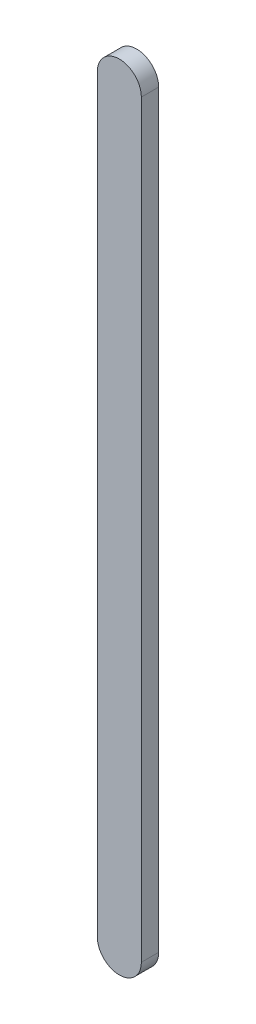
ISO-10303-21;
HEADER;
FILE_DESCRIPTION(('STEP AP214'),'2;1');
FILE_NAME('part.step','',(''),(''),'','','');
FILE_SCHEMA(('AUTOMOTIVE_DESIGN { 1 0 10303 214 1 1 1 1 }'));
ENDSEC;
DATA;
#1=APPLICATION_CONTEXT('core data for automotive mechanical design processes');
#2=APPLICATION_PROTOCOL_DEFINITION('international standard','automotive_design',2000,#1);
#3=PRODUCT_CONTEXT('',#1,'mechanical');
#4=PRODUCT('Part','Part','',(#3));
#5=PRODUCT_RELATED_PRODUCT_CATEGORY('part','',(#4));
#6=PRODUCT_DEFINITION_FORMATION('','',#4);
#7=PRODUCT_DEFINITION_CONTEXT('part definition',#1,'design');
#8=PRODUCT_DEFINITION('design','',#6,#7);
#9=PRODUCT_DEFINITION_SHAPE('','',#8);
#10=(LENGTH_UNIT() NAMED_UNIT(*) SI_UNIT(.MILLI.,.METRE.));
#11=(NAMED_UNIT(*) PLANE_ANGLE_UNIT() SI_UNIT($,.RADIAN.));
#12=(NAMED_UNIT(*) SI_UNIT($,.STERADIAN.) SOLID_ANGLE_UNIT());
#13=UNCERTAINTY_MEASURE_WITH_UNIT(LENGTH_MEASURE(1.E-05),#10,'distance_accuracy_value','');
#14=(GEOMETRIC_REPRESENTATION_CONTEXT(3) GLOBAL_UNCERTAINTY_ASSIGNED_CONTEXT((#13)) GLOBAL_UNIT_ASSIGNED_CONTEXT((#10,
#11,#12)) REPRESENTATION_CONTEXT('',''));
#15=CARTESIAN_POINT('',(0.,0.,0.));
#16=DIRECTION('',(0.,0.,1.));
#17=DIRECTION('',(1.,0.,0.));
#18=AXIS2_PLACEMENT_3D('',#15,#16,#17);
#19=CARTESIAN_POINT('',(130.937,78.212696,0.));
#20=DIRECTION('',(-1.,0.,0.));
#21=DIRECTION('',(0.,1.,0.));
#22=AXIS2_PLACEMENT_3D('',#19,#20,#21);
#23=PLANE('',#22);
#24=DIRECTION('',(0.,1.,0.));
#25=VECTOR('',#24,1.);
#26=CARTESIAN_POINT('',(130.937,78.212696,0.1999996));
#27=LINE('',#26,#25);
#28=CARTESIAN_POINT('',(130.937,78.212696,0.1999996));
#29=VERTEX_POINT('',#28);
#30=CARTESIAN_POINT('',(130.937,86.8607356,0.1999996));
#31=VERTEX_POINT('',#30);
#32=EDGE_CURVE('E11',#29,#31,#27,.T.);
#33=ORIENTED_EDGE('',*,*,#32,.F.);
#34=DIRECTION('',(0.,0.,1.));
#35=VECTOR('',#34,1.);
#36=CARTESIAN_POINT('',(130.937,78.212696,0.));
#37=LINE('',#36,#35);
#38=CARTESIAN_POINT('',(130.937,78.212696,0.));
#39=VERTEX_POINT('',#38);
#40=EDGE_CURVE('E24',#39,#29,#37,.T.);
#41=ORIENTED_EDGE('',*,*,#40,.F.);
#42=DIRECTION('',(0.,1.,0.));
#43=VECTOR('',#42,1.);
#44=CARTESIAN_POINT('',(130.937,78.212696,0.));
#45=LINE('',#44,#43);
#46=CARTESIAN_POINT('',(130.937,86.8607356,0.));
#47=VERTEX_POINT('',#46);
#48=EDGE_CURVE('E75',#39,#47,#45,.T.);
#49=ORIENTED_EDGE('',*,*,#48,.T.);
#50=DIRECTION('',(0.,0.,1.));
#51=VECTOR('',#50,1.);
#52=CARTESIAN_POINT('',(130.937,86.8607356,0.));
#53=LINE('',#52,#51);
#54=EDGE_CURVE('E37',#47,#31,#53,.T.);
#55=ORIENTED_EDGE('',*,*,#54,.T.);
#56=EDGE_LOOP('',(#33,#41,#49,#55));
#57=FACE_BOUND('',#56,.T.);
#58=ADVANCED_FACE('F17',(#57),#23,.F.);
#59=CARTESIAN_POINT('',(130.683,86.8607356,0.));
#60=DIRECTION('',(0.,0.,-1.));
#61=DIRECTION('',(1.,1.1189649382048E-13,0.));
#62=AXIS2_PLACEMENT_3D('',#59,#60,#61);
#63=CYLINDRICAL_SURFACE('',#62,0.25400000000001);
#64=CARTESIAN_POINT('',(130.683,86.8607356,0.1999996));
#65=DIRECTION('',(0.,0.,1.));
#66=DIRECTION('',(1.,1.1189649382048E-13,0.));
#67=AXIS2_PLACEMENT_3D('',#64,#65,#66);
#68=CIRCLE('',#67,0.25400000000001);
#69=CARTESIAN_POINT('',(130.429,86.8607356,0.1999996));
#70=VERTEX_POINT('',#69);
#71=EDGE_CURVE('E83',#31,#70,#68,.T.);
#72=ORIENTED_EDGE('',*,*,#71,.F.);
#73=ORIENTED_EDGE('',*,*,#54,.F.);
#74=CARTESIAN_POINT('',(130.683,86.8607356,0.));
#75=DIRECTION('',(0.,0.,1.));
#76=DIRECTION('',(1.,1.1189649382048E-13,0.));
#77=AXIS2_PLACEMENT_3D('',#74,#75,#76);
#78=CIRCLE('',#77,0.25400000000001);
#79=CARTESIAN_POINT('',(130.429,86.8607356,0.));
#80=VERTEX_POINT('',#79);
#81=EDGE_CURVE('E81',#47,#80,#78,.T.);
#82=ORIENTED_EDGE('',*,*,#81,.T.);
#83=DIRECTION('',(0.,0.,1.));
#84=VECTOR('',#83,1.);
#85=CARTESIAN_POINT('',(130.429,86.8607356,0.));
#86=LINE('',#85,#84);
#87=EDGE_CURVE('E67',#80,#70,#86,.T.);
#88=ORIENTED_EDGE('',*,*,#87,.T.);
#89=EDGE_LOOP('',(#72,#73,#82,#88));
#90=FACE_BOUND('',#89,.T.);
#91=ADVANCED_FACE('F89',(#90),#63,.T.);
#92=CARTESIAN_POINT('',(130.429,86.8607356,0.));
#93=DIRECTION('',(1.,0.,0.));
#94=DIRECTION('',(0.,-1.,0.));
#95=AXIS2_PLACEMENT_3D('',#92,#93,#94);
#96=PLANE('',#95);
#97=DIRECTION('',(0.,-1.,0.));
#98=VECTOR('',#97,1.);
#99=CARTESIAN_POINT('',(130.429,86.8607356,0.1999996));
#100=LINE('',#99,#98);
#101=CARTESIAN_POINT('',(130.429,78.212696,0.1999996));
#102=VERTEX_POINT('',#101);
#103=EDGE_CURVE('E71',#70,#102,#100,.T.);
#104=ORIENTED_EDGE('',*,*,#103,.F.);
#105=ORIENTED_EDGE('',*,*,#87,.F.);
#106=DIRECTION('',(0.,-1.,0.));
#107=VECTOR('',#106,1.);
#108=CARTESIAN_POINT('',(130.429,86.8607356,0.));
#109=LINE('',#108,#107);
#110=CARTESIAN_POINT('',(130.429,78.212696,0.));
#111=VERTEX_POINT('',#110);
#112=EDGE_CURVE('E63',#80,#111,#109,.T.);
#113=ORIENTED_EDGE('',*,*,#112,.T.);
#114=DIRECTION('',(0.,0.,1.));
#115=VECTOR('',#114,1.);
#116=CARTESIAN_POINT('',(130.429,78.212696,0.));
#117=LINE('',#116,#115);
#118=EDGE_CURVE('E53',#111,#102,#117,.T.);
#119=ORIENTED_EDGE('',*,*,#118,.T.);
#120=EDGE_LOOP('',(#104,#105,#113,#119));
#121=FACE_BOUND('',#120,.T.);
#122=ADVANCED_FACE('F66',(#121),#96,.F.);
#123=CARTESIAN_POINT('',(130.683,78.212696,0.));
#124=DIRECTION('',(0.,0.,-1.));
#125=DIRECTION('',(-1.,-1.11896493820492E-13,0.));
#126=AXIS2_PLACEMENT_3D('',#123,#124,#125);
#127=CYLINDRICAL_SURFACE('',#126,0.25400000000001);
#128=CARTESIAN_POINT('',(130.683,78.212696,0.1999996));
#129=DIRECTION('',(0.,0.,1.));
#130=DIRECTION('',(-1.,-1.11896493820492E-13,0.));
#131=AXIS2_PLACEMENT_3D('',#128,#129,#130);
#132=CIRCLE('',#131,0.25400000000001);
#133=EDGE_CURVE('E59',#102,#29,#132,.T.);
#134=ORIENTED_EDGE('',*,*,#133,.F.);
#135=ORIENTED_EDGE('',*,*,#118,.F.);
#136=CARTESIAN_POINT('',(130.683,78.212696,0.));
#137=DIRECTION('',(0.,0.,1.));
#138=DIRECTION('',(-1.,-1.11896493820492E-13,0.));
#139=AXIS2_PLACEMENT_3D('',#136,#137,#138);
#140=CIRCLE('',#139,0.25400000000001);
#141=EDGE_CURVE('E57',#111,#39,#140,.T.);
#142=ORIENTED_EDGE('',*,*,#141,.T.);
#143=ORIENTED_EDGE('',*,*,#40,.T.);
#144=EDGE_LOOP('',(#134,#135,#142,#143));
#145=FACE_BOUND('',#144,.T.);
#146=ADVANCED_FACE('F55',(#145),#127,.T.);
#147=CARTESIAN_POINT('',(130.937,78.212696,0.));
#148=DIRECTION('',(0.,0.,-1.));
#149=DIRECTION('',(-1.,0.,0.));
#150=AXIS2_PLACEMENT_3D('',#147,#148,#149);
#151=PLANE('',#150);
#152=ORIENTED_EDGE('',*,*,#141,.F.);
#153=ORIENTED_EDGE('',*,*,#112,.F.);
#154=ORIENTED_EDGE('',*,*,#81,.F.);
#155=ORIENTED_EDGE('',*,*,#48,.F.);
#156=EDGE_LOOP('',(#152,#153,#154,#155));
#157=FACE_BOUND('',#156,.T.);
#158=ADVANCED_FACE('F74',(#157),#151,.T.);
#159=CARTESIAN_POINT('',(130.937,78.212696,0.1999996));
#160=DIRECTION('',(0.,0.,-1.));
#161=DIRECTION('',(-1.,0.,0.));
#162=AXIS2_PLACEMENT_3D('',#159,#160,#161);
#163=PLANE('',#162);
#164=ORIENTED_EDGE('',*,*,#32,.T.);
#165=ORIENTED_EDGE('',*,*,#71,.T.);
#166=ORIENTED_EDGE('',*,*,#103,.T.);
#167=ORIENTED_EDGE('',*,*,#133,.T.);
#168=EDGE_LOOP('',(#164,#165,#166,#167));
#169=FACE_BOUND('',#168,.T.);
#170=ADVANCED_FACE('F91',(#169),#163,.F.);
#171=CLOSED_SHELL('',(#58,#91,#122,#146,#158,#170));
#172=MANIFOLD_SOLID_BREP('B1',#171);
#173=ADVANCED_BREP_SHAPE_REPRESENTATION('',(#18,#172),#14);
#174=SHAPE_DEFINITION_REPRESENTATION(#9,#173);
ENDSEC;
END-ISO-10303-21;
